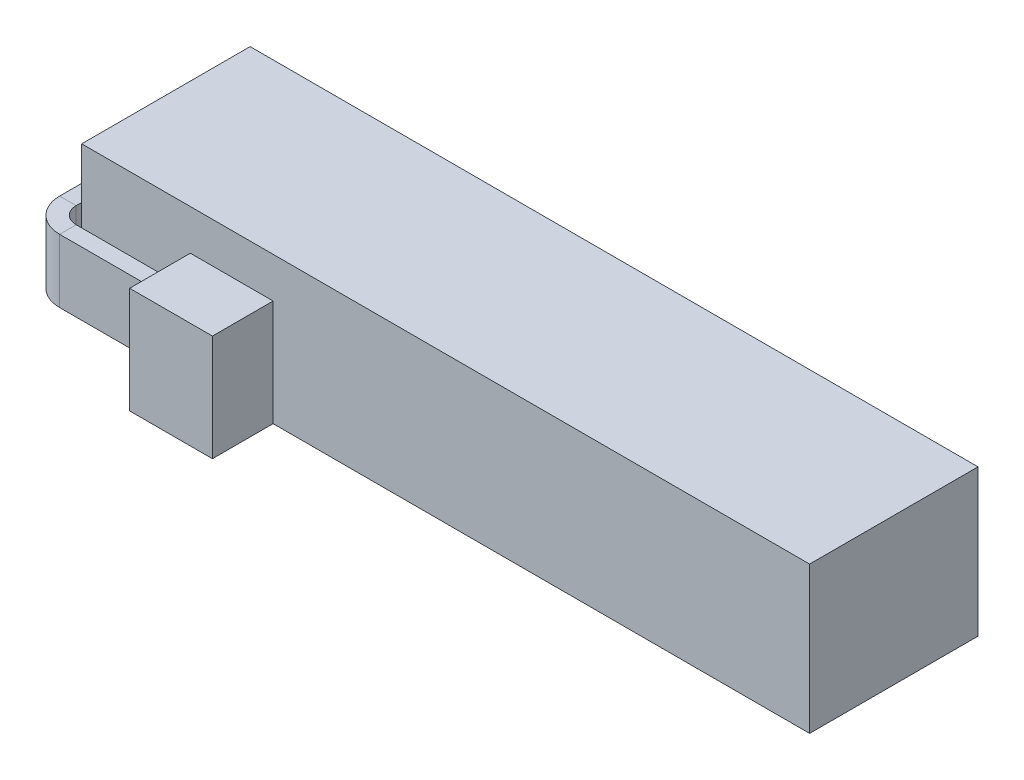
ISO-10303-21;
HEADER;
FILE_DESCRIPTION(('STEP AP214'),'2;1');
FILE_NAME('part.step','',(''),(''),'','','');
FILE_SCHEMA(('AUTOMOTIVE_DESIGN { 1 0 10303 214 1 1 1 1 }'));
ENDSEC;
DATA;
#1=APPLICATION_CONTEXT('core data for automotive mechanical design processes');
#2=APPLICATION_PROTOCOL_DEFINITION('international standard','automotive_design',2000,#1);
#3=PRODUCT_CONTEXT('',#1,'mechanical');
#4=PRODUCT('Part','Part','',(#3));
#5=PRODUCT_RELATED_PRODUCT_CATEGORY('part','',(#4));
#6=PRODUCT_DEFINITION_FORMATION('','',#4);
#7=PRODUCT_DEFINITION_CONTEXT('part definition',#1,'design');
#8=PRODUCT_DEFINITION('design','',#6,#7);
#9=PRODUCT_DEFINITION_SHAPE('','',#8);
#10=(LENGTH_UNIT() NAMED_UNIT(*) SI_UNIT(.MILLI.,.METRE.));
#11=(NAMED_UNIT(*) PLANE_ANGLE_UNIT() SI_UNIT($,.RADIAN.));
#12=(NAMED_UNIT(*) SI_UNIT($,.STERADIAN.) SOLID_ANGLE_UNIT());
#13=UNCERTAINTY_MEASURE_WITH_UNIT(LENGTH_MEASURE(1.E-05),#10,'distance_accuracy_value','');
#14=(GEOMETRIC_REPRESENTATION_CONTEXT(3) GLOBAL_UNCERTAINTY_ASSIGNED_CONTEXT((#13)) GLOBAL_UNIT_ASSIGNED_CONTEXT((#10,
#11,#12)) REPRESENTATION_CONTEXT('',''));
#15=CARTESIAN_POINT('',(0.,0.,0.));
#16=DIRECTION('',(0.,0.,1.));
#17=DIRECTION('',(1.,0.,0.));
#18=AXIS2_PLACEMENT_3D('',#15,#16,#17);
#19=CARTESIAN_POINT('',(10.,-6.75000000000002,13.338));
#20=DIRECTION('',(1.,0.,0.));
#21=DIRECTION('',(0.,1.,0.));
#22=AXIS2_PLACEMENT_3D('',#19,#20,#21);
#23=PLANE('',#22);
#24=DIRECTION('',(0.,-1.,0.));
#25=VECTOR('',#24,1.);
#26=CARTESIAN_POINT('',(10.,-6.75000000000002,7.75000000000001));
#27=LINE('',#26,#25);
#28=CARTESIAN_POINT('',(10.,3.02899999999998,7.75000000000001));
#29=VERTEX_POINT('',#28);
#30=CARTESIAN_POINT('',(10.,-6.75000000000002,7.75000000000001));
#31=VERTEX_POINT('',#30);
#32=EDGE_CURVE('E242',#29,#31,#27,.T.);
#33=ORIENTED_EDGE('',*,*,#32,.T.);
#34=DIRECTION('',(0.,0.,-1.));
#35=VECTOR('',#34,1.);
#36=CARTESIAN_POINT('',(10.,-6.75000000000002,13.338));
#37=LINE('',#36,#35);
#38=CARTESIAN_POINT('',(10.,-6.75000000000002,13.338));
#39=VERTEX_POINT('',#38);
#40=EDGE_CURVE('E269',#39,#31,#37,.T.);
#41=ORIENTED_EDGE('',*,*,#40,.F.);
#42=DIRECTION('',(0.,-1.,0.));
#43=VECTOR('',#42,1.);
#44=CARTESIAN_POINT('',(10.,-6.75000000000002,13.338));
#45=LINE('',#44,#43);
#46=CARTESIAN_POINT('',(10.,3.02899999999998,13.338));
#47=VERTEX_POINT('',#46);
#48=EDGE_CURVE('E243',#47,#39,#45,.T.);
#49=ORIENTED_EDGE('',*,*,#48,.F.);
#50=DIRECTION('',(0.,0.,-1.));
#51=VECTOR('',#50,1.);
#52=CARTESIAN_POINT('',(10.,3.02899999999998,13.338));
#53=LINE('',#52,#51);
#54=EDGE_CURVE('E253',#47,#29,#53,.T.);
#55=ORIENTED_EDGE('',*,*,#54,.T.);
#56=EDGE_LOOP('',(#33,#41,#49,#55));
#57=FACE_BOUND('',#56,.T.);
#58=DIRECTION('',(0.,-1.,0.));
#59=VECTOR('',#58,1.);
#60=CARTESIAN_POINT('',(10.,1.06049999999998,8.76600000000001));
#61=LINE('',#60,#59);
#62=CARTESIAN_POINT('',(10.,1.06049999999998,8.76600000000001));
#63=VERTEX_POINT('',#62);
#64=CARTESIAN_POINT('',(10.,-4.78150000000002,8.76600000000001));
#65=VERTEX_POINT('',#64);
#66=EDGE_CURVE('E195',#63,#65,#61,.T.);
#67=ORIENTED_EDGE('',*,*,#66,.F.);
#68=DIRECTION('',(0.,0.,-1.));
#69=VECTOR('',#68,1.);
#70=CARTESIAN_POINT('',(10.,1.06049999999998,8.76600000000001));
#71=LINE('',#70,#69);
#72=CARTESIAN_POINT('',(10.,1.06049999999998,10.29));
#73=VERTEX_POINT('',#72);
#74=EDGE_CURVE('E235',#73,#63,#71,.T.);
#75=ORIENTED_EDGE('',*,*,#74,.F.);
#76=DIRECTION('',(0.,1.,0.));
#77=VECTOR('',#76,1.);
#78=CARTESIAN_POINT('',(10.,1.06049999999998,10.29));
#79=LINE('',#78,#77);
#80=CARTESIAN_POINT('',(10.,-4.78150000000002,10.29));
#81=VERTEX_POINT('',#80);
#82=EDGE_CURVE('E63',#81,#73,#79,.T.);
#83=ORIENTED_EDGE('',*,*,#82,.F.);
#84=DIRECTION('',(0.,0.,1.));
#85=VECTOR('',#84,1.);
#86=CARTESIAN_POINT('',(10.,-4.78150000000002,8.76600000000001));
#87=LINE('',#86,#85);
#88=EDGE_CURVE('E58',#65,#81,#87,.T.);
#89=ORIENTED_EDGE('',*,*,#88,.F.);
#90=EDGE_LOOP('',(#67,#75,#83,#89));
#91=FACE_BOUND('',#90,.T.);
#92=ADVANCED_FACE('F43',(#57,#91),#23,.F.);
#93=CARTESIAN_POINT('',(67.,-6.75000000000002,7.75000000000001));
#94=DIRECTION('',(0.,0.,-1.));
#95=DIRECTION('',(-1.,0.,0.));
#96=AXIS2_PLACEMENT_3D('',#93,#94,#95);
#97=PLANE('',#96);
#98=ORIENTED_EDGE('',*,*,#32,.F.);
#99=DIRECTION('',(-1.,0.,0.));
#100=VECTOR('',#99,1.);
#101=CARTESIAN_POINT('',(10.,3.02899999999998,7.75000000000001));
#102=LINE('',#101,#100);
#103=CARTESIAN_POINT('',(17.62,3.02899999999998,7.75000000000001));
#104=VERTEX_POINT('',#103);
#105=EDGE_CURVE('E247',#104,#29,#102,.T.);
#106=ORIENTED_EDGE('',*,*,#105,.F.);
#107=DIRECTION('',(0.,1.,0.));
#108=VECTOR('',#107,1.);
#109=CARTESIAN_POINT('',(17.62,-6.75000000000002,7.75000000000001));
#110=LINE('',#109,#108);
#111=CARTESIAN_POINT('',(17.62,-6.75000000000002,7.75000000000001));
#112=VERTEX_POINT('',#111);
#113=EDGE_CURVE('E256',#112,#104,#110,.T.);
#114=ORIENTED_EDGE('',*,*,#113,.F.);
#115=DIRECTION('',(-1.,0.,0.));
#116=VECTOR('',#115,1.);
#117=CARTESIAN_POINT('',(67.,-6.75000000000002,7.75000000000001));
#118=LINE('',#117,#116);
#119=CARTESIAN_POINT('',(67.,-6.75000000000002,7.75000000000001));
#120=VERTEX_POINT('',#119);
#121=EDGE_CURVE('E11',#120,#112,#118,.T.);
#122=ORIENTED_EDGE('',*,*,#121,.F.);
#123=DIRECTION('',(0.,-1.,0.));
#124=VECTOR('',#123,1.);
#125=CARTESIAN_POINT('',(67.,-6.75000000000002,7.75000000000001));
#126=LINE('',#125,#124);
#127=CARTESIAN_POINT('',(67.,6.74999999999999,7.75000000000001));
#128=VERTEX_POINT('',#127);
#129=EDGE_CURVE('E273',#128,#120,#126,.T.);
#130=ORIENTED_EDGE('',*,*,#129,.F.);
#131=DIRECTION('',(-1.,0.,0.));
#132=VECTOR('',#131,1.);
#133=CARTESIAN_POINT('',(67.,6.74999999999999,7.75000000000001));
#134=LINE('',#133,#132);
#135=CARTESIAN_POINT('',(0.,6.74999999999999,7.75000000000001));
#136=VERTEX_POINT('',#135);
#137=EDGE_CURVE('E283',#128,#136,#134,.T.);
#138=ORIENTED_EDGE('',*,*,#137,.T.);
#139=DIRECTION('',(0.,-1.,0.));
#140=VECTOR('',#139,1.);
#141=CARTESIAN_POINT('',(0.,-6.75000000000002,7.75000000000001));
#142=LINE('',#141,#140);
#143=CARTESIAN_POINT('',(0.,-6.75000000000002,7.75000000000001));
#144=VERTEX_POINT('',#143);
#145=EDGE_CURVE('E272',#136,#144,#142,.T.);
#146=ORIENTED_EDGE('',*,*,#145,.T.);
#147=EDGE_CURVE('E51',#31,#144,#118,.T.);
#148=ORIENTED_EDGE('',*,*,#147,.F.);
#149=EDGE_LOOP('',(#98,#106,#114,#122,#130,#138,#146,#148));
#150=FACE_BOUND('',#149,.T.);
#151=ADVANCED_FACE('F45',(#150),#97,.F.);
#152=CARTESIAN_POINT('',(67.,-6.75000000000002,-7.74999999999999));
#153=DIRECTION('',(0.,1.,0.));
#154=DIRECTION('',(0.,0.,1.));
#155=AXIS2_PLACEMENT_3D('',#152,#153,#154);
#156=PLANE('',#155);
#157=DIRECTION('',(0.,0.,-1.));
#158=VECTOR('',#157,1.);
#159=CARTESIAN_POINT('',(0.,-6.75000000000002,-7.74999999999999));
#160=LINE('',#159,#158);
#161=CARTESIAN_POINT('',(0.,-6.75000000000002,-7.74999999999999));
#162=VERTEX_POINT('',#161);
#163=EDGE_CURVE('E286',#144,#162,#160,.T.);
#164=ORIENTED_EDGE('',*,*,#163,.T.);
#165=DIRECTION('',(-1.,0.,0.));
#166=VECTOR('',#165,1.);
#167=CARTESIAN_POINT('',(67.,-6.75000000000002,-7.74999999999999));
#168=LINE('',#167,#166);
#169=CARTESIAN_POINT('',(67.,-6.75000000000002,-7.74999999999999));
#170=VERTEX_POINT('',#169);
#171=EDGE_CURVE('E295',#170,#162,#168,.T.);
#172=ORIENTED_EDGE('',*,*,#171,.F.);
#173=DIRECTION('',(0.,0.,-1.));
#174=VECTOR('',#173,1.);
#175=CARTESIAN_POINT('',(67.,-6.75000000000002,-7.74999999999999));
#176=LINE('',#175,#174);
#177=EDGE_CURVE('E276',#120,#170,#176,.T.);
#178=ORIENTED_EDGE('',*,*,#177,.F.);
#179=ORIENTED_EDGE('',*,*,#121,.T.);
#180=DIRECTION('',(0.,0.,-1.));
#181=VECTOR('',#180,1.);
#182=CARTESIAN_POINT('',(17.62,-6.75000000000002,13.338));
#183=LINE('',#182,#181);
#184=CARTESIAN_POINT('',(17.62,-6.75000000000002,13.338));
#185=VERTEX_POINT('',#184);
#186=EDGE_CURVE('E266',#185,#112,#183,.T.);
#187=ORIENTED_EDGE('',*,*,#186,.F.);
#188=DIRECTION('',(1.,0.,0.));
#189=VECTOR('',#188,1.);
#190=CARTESIAN_POINT('',(10.,-6.75000000000002,13.338));
#191=LINE('',#190,#189);
#192=EDGE_CURVE('E246',#39,#185,#191,.T.);
#193=ORIENTED_EDGE('',*,*,#192,.F.);
#194=ORIENTED_EDGE('',*,*,#40,.T.);
#195=ORIENTED_EDGE('',*,*,#147,.T.);
#196=EDGE_LOOP('',(#164,#172,#178,#179,#187,#193,#194,#195));
#197=FACE_BOUND('',#196,.T.);
#198=ADVANCED_FACE('F303',(#197),#156,.F.);
#199=CARTESIAN_POINT('',(67.,-6.75000000000002,-7.74999999999999));
#200=DIRECTION('',(0.,0.,1.));
#201=DIRECTION('',(1.,0.,0.));
#202=AXIS2_PLACEMENT_3D('',#199,#200,#201);
#203=PLANE('',#202);
#204=DIRECTION('',(0.,1.,0.));
#205=VECTOR('',#204,1.);
#206=CARTESIAN_POINT('',(0.,-6.75000000000002,-7.74999999999999));
#207=LINE('',#206,#205);
#208=CARTESIAN_POINT('',(0.,6.74999999999999,-7.74999999999999));
#209=VERTEX_POINT('',#208);
#210=EDGE_CURVE('E288',#162,#209,#207,.T.);
#211=ORIENTED_EDGE('',*,*,#210,.T.);
#212=DIRECTION('',(-1.,0.,0.));
#213=VECTOR('',#212,1.);
#214=CARTESIAN_POINT('',(67.,6.74999999999999,-7.74999999999999));
#215=LINE('',#214,#213);
#216=CARTESIAN_POINT('',(67.,6.74999999999999,-7.74999999999999));
#217=VERTEX_POINT('',#216);
#218=EDGE_CURVE('E293',#217,#209,#215,.T.);
#219=ORIENTED_EDGE('',*,*,#218,.F.);
#220=DIRECTION('',(0.,1.,0.));
#221=VECTOR('',#220,1.);
#222=CARTESIAN_POINT('',(67.,-6.75000000000002,-7.74999999999999));
#223=LINE('',#222,#221);
#224=EDGE_CURVE('E279',#170,#217,#223,.T.);
#225=ORIENTED_EDGE('',*,*,#224,.F.);
#226=ORIENTED_EDGE('',*,*,#171,.T.);
#227=EDGE_LOOP('',(#211,#219,#225,#226));
#228=FACE_BOUND('',#227,.T.);
#229=ADVANCED_FACE('F317',(#228),#203,.F.);
#230=CARTESIAN_POINT('',(67.,6.74999999999999,-7.74999999999999));
#231=DIRECTION('',(0.,-1.,0.));
#232=DIRECTION('',(0.,0.,-1.));
#233=AXIS2_PLACEMENT_3D('',#230,#231,#232);
#234=PLANE('',#233);
#235=DIRECTION('',(0.,0.,1.));
#236=VECTOR('',#235,1.);
#237=CARTESIAN_POINT('',(0.,6.74999999999999,-7.74999999999999));
#238=LINE('',#237,#236);
#239=EDGE_CURVE('E277',#209,#136,#238,.T.);
#240=ORIENTED_EDGE('',*,*,#239,.T.);
#241=ORIENTED_EDGE('',*,*,#137,.F.);
#242=DIRECTION('',(0.,0.,1.));
#243=VECTOR('',#242,1.);
#244=CARTESIAN_POINT('',(67.,6.74999999999999,-7.74999999999999));
#245=LINE('',#244,#243);
#246=EDGE_CURVE('E281',#217,#128,#245,.T.);
#247=ORIENTED_EDGE('',*,*,#246,.F.);
#248=ORIENTED_EDGE('',*,*,#218,.T.);
#249=EDGE_LOOP('',(#240,#241,#247,#248));
#250=FACE_BOUND('',#249,.T.);
#251=ADVANCED_FACE('F315',(#250),#234,.F.);
#252=CARTESIAN_POINT('',(67.,0.,0.));
#253=DIRECTION('',(1.,0.,0.));
#254=DIRECTION('',(0.,0.,-1.));
#255=AXIS2_PLACEMENT_3D('',#252,#253,#254);
#256=PLANE('',#255);
#257=ORIENTED_EDGE('',*,*,#129,.T.);
#258=ORIENTED_EDGE('',*,*,#177,.T.);
#259=ORIENTED_EDGE('',*,*,#224,.T.);
#260=ORIENTED_EDGE('',*,*,#246,.T.);
#261=EDGE_LOOP('',(#257,#258,#259,#260));
#262=FACE_BOUND('',#261,.T.);
#263=ADVANCED_FACE('F319',(#262),#256,.T.);
#264=CARTESIAN_POINT('',(0.,0.,0.));
#265=DIRECTION('',(1.,0.,0.));
#266=DIRECTION('',(0.,0.,-1.));
#267=AXIS2_PLACEMENT_3D('',#264,#265,#266);
#268=PLANE('',#267);
#269=ORIENTED_EDGE('',*,*,#145,.F.);
#270=ORIENTED_EDGE('',*,*,#239,.F.);
#271=ORIENTED_EDGE('',*,*,#210,.F.);
#272=ORIENTED_EDGE('',*,*,#163,.F.);
#273=EDGE_LOOP('',(#269,#270,#271,#272));
#274=FACE_BOUND('',#273,.T.);
#275=ADVANCED_FACE('F308',(#274),#268,.F.);
#276=CARTESIAN_POINT('',(17.62,-6.75000000000002,13.338));
#277=DIRECTION('',(-1.,0.,0.));
#278=DIRECTION('',(0.,0.,1.));
#279=AXIS2_PLACEMENT_3D('',#276,#277,#278);
#280=PLANE('',#279);
#281=ORIENTED_EDGE('',*,*,#113,.T.);
#282=DIRECTION('',(0.,0.,-1.));
#283=VECTOR('',#282,1.);
#284=CARTESIAN_POINT('',(17.62,3.02899999999998,13.338));
#285=LINE('',#284,#283);
#286=CARTESIAN_POINT('',(17.62,3.02899999999998,13.338));
#287=VERTEX_POINT('',#286);
#288=EDGE_CURVE('E263',#287,#104,#285,.T.);
#289=ORIENTED_EDGE('',*,*,#288,.F.);
#290=DIRECTION('',(0.,1.,0.));
#291=VECTOR('',#290,1.);
#292=CARTESIAN_POINT('',(17.62,-6.75000000000002,13.338));
#293=LINE('',#292,#291);
#294=EDGE_CURVE('E249',#185,#287,#293,.T.);
#295=ORIENTED_EDGE('',*,*,#294,.F.);
#296=ORIENTED_EDGE('',*,*,#186,.T.);
#297=EDGE_LOOP('',(#281,#289,#295,#296));
#298=FACE_BOUND('',#297,.T.);
#299=ADVANCED_FACE('F323',(#298),#280,.F.);
#300=CARTESIAN_POINT('',(10.,3.02899999999998,13.338));
#301=DIRECTION('',(0.,-1.,0.));
#302=DIRECTION('',(0.,0.,-1.));
#303=AXIS2_PLACEMENT_3D('',#300,#301,#302);
#304=PLANE('',#303);
#305=ORIENTED_EDGE('',*,*,#105,.T.);
#306=ORIENTED_EDGE('',*,*,#54,.F.);
#307=DIRECTION('',(-1.,0.,0.));
#308=VECTOR('',#307,1.);
#309=CARTESIAN_POINT('',(10.,3.02899999999998,13.338));
#310=LINE('',#309,#308);
#311=EDGE_CURVE('E251',#287,#47,#310,.T.);
#312=ORIENTED_EDGE('',*,*,#311,.F.);
#313=ORIENTED_EDGE('',*,*,#288,.T.);
#314=EDGE_LOOP('',(#305,#306,#312,#313));
#315=FACE_BOUND('',#314,.T.);
#316=ADVANCED_FACE('F332',(#315),#304,.F.);
#317=CARTESIAN_POINT('',(0.,0.,13.338));
#318=DIRECTION('',(0.,0.,-1.));
#319=DIRECTION('',(-1.,0.,0.));
#320=AXIS2_PLACEMENT_3D('',#317,#318,#319);
#321=PLANE('',#320);
#322=ORIENTED_EDGE('',*,*,#48,.T.);
#323=ORIENTED_EDGE('',*,*,#192,.T.);
#324=ORIENTED_EDGE('',*,*,#294,.T.);
#325=ORIENTED_EDGE('',*,*,#311,.T.);
#326=EDGE_LOOP('',(#322,#323,#324,#325));
#327=FACE_BOUND('',#326,.T.);
#328=ADVANCED_FACE('F327',(#327),#321,.F.);
#329=CARTESIAN_POINT('',(7.75000000000002,0.,-7.74999999999999));
#330=DIRECTION('',(0.,0.,-1.));
#331=DIRECTION('',(0.,-1.,0.));
#332=AXIS2_PLACEMENT_3D('',#329,#330,#331);
#333=PLANE('',#332);
#334=DIRECTION('',(0.,-1.,0.));
#335=VECTOR('',#334,1.);
#336=CARTESIAN_POINT('',(-1.016,1.06049999999998,-7.74999999999999));
#337=LINE('',#336,#335);
#338=CARTESIAN_POINT('',(-1.016,1.06049999999998,-7.74999999999999));
#339=VERTEX_POINT('',#338);
#340=CARTESIAN_POINT('',(-1.016,-4.78150000000002,-7.74999999999999));
#341=VERTEX_POINT('',#340);
#342=EDGE_CURVE('E155',#339,#341,#337,.T.);
#343=ORIENTED_EDGE('',*,*,#342,.T.);
#344=DIRECTION('',(-1.,0.,0.));
#345=VECTOR('',#344,1.);
#346=CARTESIAN_POINT('',(-1.016,-4.78150000000002,-7.74999999999999));
#347=LINE('',#346,#345);
#348=CARTESIAN_POINT('',(-2.54,-4.78150000000002,-7.74999999999999));
#349=VERTEX_POINT('',#348);
#350=EDGE_CURVE('E165',#341,#349,#347,.T.);
#351=ORIENTED_EDGE('',*,*,#350,.T.);
#352=DIRECTION('',(0.,1.,0.));
#353=VECTOR('',#352,1.);
#354=CARTESIAN_POINT('',(-2.54,1.06049999999998,-7.74999999999999));
#355=LINE('',#354,#353);
#356=CARTESIAN_POINT('',(-2.54,1.06049999999998,-7.74999999999999));
#357=VERTEX_POINT('',#356);
#358=EDGE_CURVE('E170',#349,#357,#355,.T.);
#359=ORIENTED_EDGE('',*,*,#358,.T.);
#360=DIRECTION('',(1.,0.,0.));
#361=VECTOR('',#360,1.);
#362=CARTESIAN_POINT('',(-1.016,1.06049999999998,-7.74999999999999));
#363=LINE('',#362,#361);
#364=EDGE_CURVE('E168',#357,#339,#363,.T.);
#365=ORIENTED_EDGE('',*,*,#364,.T.);
#366=EDGE_LOOP('',(#343,#351,#359,#365));
#367=FACE_BOUND('',#366,.T.);
#368=ADVANCED_FACE('F169',(#367),#333,.T.);
#369=CARTESIAN_POINT('',(-1.016,1.06049999999998,-7.74999999999999));
#370=DIRECTION('',(-1.,0.,0.));
#371=DIRECTION('',(0.,0.,1.));
#372=AXIS2_PLACEMENT_3D('',#369,#370,#371);
#373=PLANE('',#372);
#374=DIRECTION('',(0.,0.,1.));
#375=VECTOR('',#374,1.);
#376=CARTESIAN_POINT('',(-1.016,-4.78150000000002,-7.74999999999999));
#377=LINE('',#376,#375);
#378=CARTESIAN_POINT('',(-1.016,-4.78150000000002,7.24200000000001));
#379=VERTEX_POINT('',#378);
#380=EDGE_CURVE('E162',#341,#379,#377,.T.);
#381=ORIENTED_EDGE('',*,*,#380,.F.);
#382=ORIENTED_EDGE('',*,*,#342,.F.);
#383=DIRECTION('',(0.,0.,1.));
#384=VECTOR('',#383,1.);
#385=CARTESIAN_POINT('',(-1.016,1.06049999999998,-7.74999999999999));
#386=LINE('',#385,#384);
#387=CARTESIAN_POINT('',(-1.016,1.06049999999998,7.242));
#388=VERTEX_POINT('',#387);
#389=EDGE_CURVE('E160',#339,#388,#386,.T.);
#390=ORIENTED_EDGE('',*,*,#389,.T.);
#391=DIRECTION('',(0.,-1.,0.));
#392=VECTOR('',#391,1.);
#393=CARTESIAN_POINT('',(-1.016,1.06049999999998,7.242));
#394=LINE('',#393,#392);
#395=EDGE_CURVE('E180',#388,#379,#394,.T.);
#396=ORIENTED_EDGE('',*,*,#395,.T.);
#397=EDGE_LOOP('',(#381,#382,#390,#396));
#398=FACE_BOUND('',#397,.T.);
#399=ADVANCED_FACE('F157',(#398),#373,.F.);
#400=CARTESIAN_POINT('',(-1.016,-4.78150000000002,-7.74999999999999));
#401=DIRECTION('',(0.,1.,0.));
#402=DIRECTION('',(-1.,0.,0.));
#403=AXIS2_PLACEMENT_3D('',#400,#401,#402);
#404=PLANE('',#403);
#405=DIRECTION('',(0.,0.,1.));
#406=VECTOR('',#405,1.);
#407=CARTESIAN_POINT('',(-2.54,-4.78150000000002,-7.74999999999999));
#408=LINE('',#407,#406);
#409=CARTESIAN_POINT('',(-2.54,-4.78150000000002,7.24200000000001));
#410=VERTEX_POINT('',#409);
#411=EDGE_CURVE('E208',#349,#410,#408,.T.);
#412=ORIENTED_EDGE('',*,*,#411,.F.);
#413=ORIENTED_EDGE('',*,*,#350,.F.);
#414=ORIENTED_EDGE('',*,*,#380,.T.);
#415=DIRECTION('',(-1.,0.,0.));
#416=VECTOR('',#415,1.);
#417=CARTESIAN_POINT('',(-1.016,-4.78150000000002,7.242));
#418=LINE('',#417,#416);
#419=EDGE_CURVE('E205',#379,#410,#418,.T.);
#420=ORIENTED_EDGE('',*,*,#419,.T.);
#421=EDGE_LOOP('',(#412,#413,#414,#420));
#422=FACE_BOUND('',#421,.T.);
#423=ADVANCED_FACE('F408',(#422),#404,.F.);
#424=CARTESIAN_POINT('',(-2.54,1.06049999999998,-7.74999999999999));
#425=DIRECTION('',(1.,0.,0.));
#426=DIRECTION('',(0.,0.,-1.));
#427=AXIS2_PLACEMENT_3D('',#424,#425,#426);
#428=PLANE('',#427);
#429=DIRECTION('',(0.,0.,1.));
#430=VECTOR('',#429,1.);
#431=CARTESIAN_POINT('',(-2.54,1.06049999999998,-7.74999999999999));
#432=LINE('',#431,#430);
#433=CARTESIAN_POINT('',(-2.54,1.06049999999998,7.242));
#434=VERTEX_POINT('',#433);
#435=EDGE_CURVE('E225',#357,#434,#432,.T.);
#436=ORIENTED_EDGE('',*,*,#435,.F.);
#437=ORIENTED_EDGE('',*,*,#358,.F.);
#438=ORIENTED_EDGE('',*,*,#411,.T.);
#439=DIRECTION('',(0.,1.,0.));
#440=VECTOR('',#439,1.);
#441=CARTESIAN_POINT('',(-2.54,1.06049999999998,7.242));
#442=LINE('',#441,#440);
#443=EDGE_CURVE('E211',#410,#434,#442,.T.);
#444=ORIENTED_EDGE('',*,*,#443,.T.);
#445=EDGE_LOOP('',(#436,#437,#438,#444));
#446=FACE_BOUND('',#445,.T.);
#447=ADVANCED_FACE('F417',(#446),#428,.F.);
#448=CARTESIAN_POINT('',(-1.016,1.06049999999998,-7.74999999999999));
#449=DIRECTION('',(0.,-1.,0.));
#450=DIRECTION('',(1.,0.,0.));
#451=AXIS2_PLACEMENT_3D('',#448,#449,#450);
#452=PLANE('',#451);
#453=DIRECTION('',(1.,0.,0.));
#454=VECTOR('',#453,1.);
#455=CARTESIAN_POINT('',(-1.016,1.06049999999998,7.242));
#456=LINE('',#455,#454);
#457=EDGE_CURVE('E178',#434,#388,#456,.T.);
#458=ORIENTED_EDGE('',*,*,#457,.T.);
#459=ORIENTED_EDGE('',*,*,#389,.F.);
#460=ORIENTED_EDGE('',*,*,#364,.F.);
#461=ORIENTED_EDGE('',*,*,#435,.T.);
#462=EDGE_LOOP('',(#458,#459,#460,#461));
#463=FACE_BOUND('',#462,.T.);
#464=ADVANCED_FACE('F176',(#463),#452,.F.);
#465=CARTESIAN_POINT('',(0.508000000000002,0.,7.24200000000001));
#466=DIRECTION('',(0.,1.,0.));
#467=DIRECTION('',(0.,0.,1.));
#468=AXIS2_PLACEMENT_3D('',#465,#466,#467);
#469=CYLINDRICAL_SURFACE('',#468,1.524);
#470=CARTESIAN_POINT('',(0.508000000000002,-4.78150000000002,7.24200000000001));
#471=DIRECTION('',(0.,1.,0.));
#472=DIRECTION('',(-1.,0.,0.));
#473=AXIS2_PLACEMENT_3D('',#470,#471,#472);
#474=CIRCLE('',#473,1.524);
#475=CARTESIAN_POINT('',(0.508000000000002,-4.78150000000002,8.76600000000001));
#476=VERTEX_POINT('',#475);
#477=EDGE_CURVE('E188',#379,#476,#474,.T.);
#478=ORIENTED_EDGE('',*,*,#477,.F.);
#479=ORIENTED_EDGE('',*,*,#395,.F.);
#480=CARTESIAN_POINT('',(0.508000000000002,1.06049999999998,7.24200000000001));
#481=DIRECTION('',(0.,1.,0.));
#482=DIRECTION('',(-1.,0.,0.));
#483=AXIS2_PLACEMENT_3D('',#480,#481,#482);
#484=CIRCLE('',#483,1.524);
#485=CARTESIAN_POINT('',(0.508,1.06049999999998,8.76600000000001));
#486=VERTEX_POINT('',#485);
#487=EDGE_CURVE('E189',#388,#486,#484,.T.);
#488=ORIENTED_EDGE('',*,*,#487,.T.);
#489=DIRECTION('',(0.,-1.,0.));
#490=VECTOR('',#489,1.);
#491=CARTESIAN_POINT('',(0.508,1.06049999999998,8.76600000000001));
#492=LINE('',#491,#490);
#493=EDGE_CURVE('E185',#486,#476,#492,.T.);
#494=ORIENTED_EDGE('',*,*,#493,.T.);
#495=EDGE_LOOP('',(#478,#479,#488,#494));
#496=FACE_BOUND('',#495,.T.);
#497=ADVANCED_FACE('F436',(#496),#469,.F.);
#498=CARTESIAN_POINT('',(-1.016,-4.78150000000002,7.242));
#499=DIRECTION('',(0.,1.,0.));
#500=DIRECTION('',(0.,0.,1.));
#501=AXIS2_PLACEMENT_3D('',#498,#499,#500);
#502=PLANE('',#501);
#503=CARTESIAN_POINT('',(0.508000000000002,-4.78150000000002,7.24200000000001));
#504=DIRECTION('',(0.,1.,0.));
#505=DIRECTION('',(-1.,0.,0.));
#506=AXIS2_PLACEMENT_3D('',#503,#504,#505);
#507=CIRCLE('',#506,3.048);
#508=CARTESIAN_POINT('',(0.508000000000002,-4.78150000000002,10.29));
#509=VERTEX_POINT('',#508);
#510=EDGE_CURVE('E214',#410,#509,#507,.T.);
#511=ORIENTED_EDGE('',*,*,#510,.F.);
#512=ORIENTED_EDGE('',*,*,#419,.F.);
#513=ORIENTED_EDGE('',*,*,#477,.T.);
#514=DIRECTION('',(0.,0.,1.));
#515=VECTOR('',#514,1.);
#516=CARTESIAN_POINT('',(0.508000000000002,-4.78150000000002,8.76600000000001));
#517=LINE('',#516,#515);
#518=EDGE_CURVE('E192',#476,#509,#517,.T.);
#519=ORIENTED_EDGE('',*,*,#518,.T.);
#520=EDGE_LOOP('',(#511,#512,#513,#519));
#521=FACE_BOUND('',#520,.T.);
#522=ADVANCED_FACE('F445',(#521),#502,.F.);
#523=CARTESIAN_POINT('',(0.508000000000002,0.,7.24200000000001));
#524=DIRECTION('',(0.,1.,0.));
#525=DIRECTION('',(0.,0.,1.));
#526=AXIS2_PLACEMENT_3D('',#523,#524,#525);
#527=CYLINDRICAL_SURFACE('',#526,3.048);
#528=CARTESIAN_POINT('',(0.508000000000002,1.06049999999998,7.24200000000001));
#529=DIRECTION('',(0.,1.,0.));
#530=DIRECTION('',(-1.,0.,0.));
#531=AXIS2_PLACEMENT_3D('',#528,#529,#530);
#532=CIRCLE('',#531,3.048);
#533=CARTESIAN_POINT('',(0.508,1.06049999999998,10.29));
#534=VERTEX_POINT('',#533);
#535=EDGE_CURVE('E229',#434,#534,#532,.T.);
#536=ORIENTED_EDGE('',*,*,#535,.F.);
#537=ORIENTED_EDGE('',*,*,#443,.F.);
#538=ORIENTED_EDGE('',*,*,#510,.T.);
#539=DIRECTION('',(0.,1.,0.));
#540=VECTOR('',#539,1.);
#541=CARTESIAN_POINT('',(0.508,1.06049999999998,10.29));
#542=LINE('',#541,#540);
#543=EDGE_CURVE('E217',#509,#534,#542,.T.);
#544=ORIENTED_EDGE('',*,*,#543,.T.);
#545=EDGE_LOOP('',(#536,#537,#538,#544));
#546=FACE_BOUND('',#545,.T.);
#547=ADVANCED_FACE('F455',(#546),#527,.T.);
#548=CARTESIAN_POINT('',(-1.016,1.06049999999998,7.242));
#549=DIRECTION('',(0.,-1.,0.));
#550=DIRECTION('',(0.,0.,-1.));
#551=AXIS2_PLACEMENT_3D('',#548,#549,#550);
#552=PLANE('',#551);
#553=DIRECTION('',(0.,0.,-1.));
#554=VECTOR('',#553,1.);
#555=CARTESIAN_POINT('',(0.508,1.06049999999998,8.76600000000001));
#556=LINE('',#555,#554);
#557=EDGE_CURVE('E203',#534,#486,#556,.T.);
#558=ORIENTED_EDGE('',*,*,#557,.T.);
#559=ORIENTED_EDGE('',*,*,#487,.F.);
#560=ORIENTED_EDGE('',*,*,#457,.F.);
#561=ORIENTED_EDGE('',*,*,#535,.T.);
#562=EDGE_LOOP('',(#558,#559,#560,#561));
#563=FACE_BOUND('',#562,.T.);
#564=ADVANCED_FACE('F465',(#563),#552,.F.);
#565=CARTESIAN_POINT('',(0.508,1.06049999999998,8.76600000000001));
#566=DIRECTION('',(0.,0.,1.));
#567=DIRECTION('',(1.,0.,0.));
#568=AXIS2_PLACEMENT_3D('',#565,#566,#567);
#569=PLANE('',#568);
#570=DIRECTION('',(1.,0.,0.));
#571=VECTOR('',#570,1.);
#572=CARTESIAN_POINT('',(0.508000000000002,-4.78150000000002,8.76600000000001));
#573=LINE('',#572,#571);
#574=EDGE_CURVE('E197',#476,#65,#573,.T.);
#575=ORIENTED_EDGE('',*,*,#574,.F.);
#576=ORIENTED_EDGE('',*,*,#493,.F.);
#577=DIRECTION('',(1.,0.,0.));
#578=VECTOR('',#577,1.);
#579=CARTESIAN_POINT('',(0.508,1.06049999999998,8.76600000000001));
#580=LINE('',#579,#578);
#581=EDGE_CURVE('E198',#486,#63,#580,.T.);
#582=ORIENTED_EDGE('',*,*,#581,.T.);
#583=ORIENTED_EDGE('',*,*,#66,.T.);
#584=EDGE_LOOP('',(#575,#576,#582,#583));
#585=FACE_BOUND('',#584,.T.);
#586=ADVANCED_FACE('F475',(#585),#569,.F.);
#587=CARTESIAN_POINT('',(0.508000000000002,-4.78150000000002,8.76600000000001));
#588=DIRECTION('',(0.,1.,0.));
#589=DIRECTION('',(0.,0.,1.));
#590=AXIS2_PLACEMENT_3D('',#587,#588,#589);
#591=PLANE('',#590);
#592=DIRECTION('',(1.,0.,0.));
#593=VECTOR('',#592,1.);
#594=CARTESIAN_POINT('',(0.508000000000002,-4.78150000000002,10.29));
#595=LINE('',#594,#593);
#596=EDGE_CURVE('E219',#509,#81,#595,.T.);
#597=ORIENTED_EDGE('',*,*,#596,.F.);
#598=ORIENTED_EDGE('',*,*,#518,.F.);
#599=ORIENTED_EDGE('',*,*,#574,.T.);
#600=ORIENTED_EDGE('',*,*,#88,.T.);
#601=EDGE_LOOP('',(#597,#598,#599,#600));
#602=FACE_BOUND('',#601,.T.);
#603=ADVANCED_FACE('F485',(#602),#591,.F.);
#604=CARTESIAN_POINT('',(0.508,1.06049999999998,10.29));
#605=DIRECTION('',(0.,0.,-1.));
#606=DIRECTION('',(-1.,0.,0.));
#607=AXIS2_PLACEMENT_3D('',#604,#605,#606);
#608=PLANE('',#607);
#609=DIRECTION('',(1.,0.,0.));
#610=VECTOR('',#609,1.);
#611=CARTESIAN_POINT('',(0.508,1.06049999999998,10.29));
#612=LINE('',#611,#610);
#613=EDGE_CURVE('E233',#534,#73,#612,.T.);
#614=ORIENTED_EDGE('',*,*,#613,.F.);
#615=ORIENTED_EDGE('',*,*,#543,.F.);
#616=ORIENTED_EDGE('',*,*,#596,.T.);
#617=ORIENTED_EDGE('',*,*,#82,.T.);
#618=EDGE_LOOP('',(#614,#615,#616,#617));
#619=FACE_BOUND('',#618,.T.);
#620=ADVANCED_FACE('F495',(#619),#608,.F.);
#621=CARTESIAN_POINT('',(0.508,1.06049999999998,8.76600000000001));
#622=DIRECTION('',(0.,-1.,0.));
#623=DIRECTION('',(0.,0.,-1.));
#624=AXIS2_PLACEMENT_3D('',#621,#622,#623);
#625=PLANE('',#624);
#626=ORIENTED_EDGE('',*,*,#74,.T.);
#627=ORIENTED_EDGE('',*,*,#581,.F.);
#628=ORIENTED_EDGE('',*,*,#557,.F.);
#629=ORIENTED_EDGE('',*,*,#613,.T.);
#630=EDGE_LOOP('',(#626,#627,#628,#629));
#631=FACE_BOUND('',#630,.T.);
#632=ADVANCED_FACE('F340',(#631),#625,.F.);
#633=CLOSED_SHELL('',(#92,#151,#198,#229,#251,#263,#275,#299,#316,#328,#368,#399,#423,#447,#464,
#497,#522,#547,#564,#586,#603,#620,#632));
#634=MANIFOLD_SOLID_BREP('B2',#633);
#635=ADVANCED_BREP_SHAPE_REPRESENTATION('',(#18,#634),#14);
#636=SHAPE_DEFINITION_REPRESENTATION(#9,#635);
ENDSEC;
END-ISO-10303-21;
